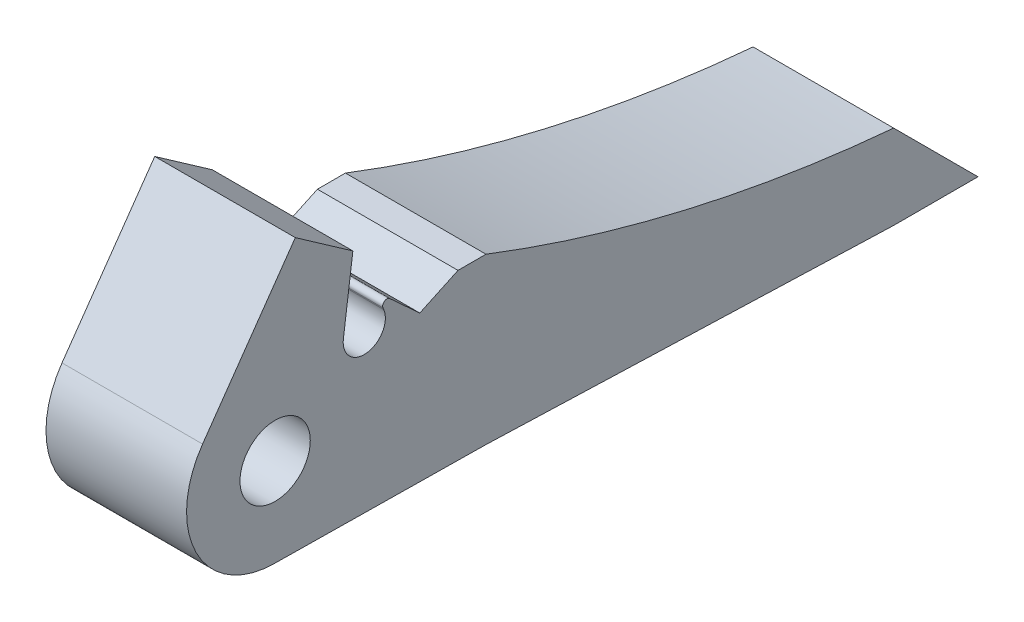
ISO-10303-21;
HEADER;
FILE_DESCRIPTION(('STEP AP214'),'2;1');
FILE_NAME('part.step','',(''),(''),'','','');
FILE_SCHEMA(('AUTOMOTIVE_DESIGN { 1 0 10303 214 1 1 1 1 }'));
ENDSEC;
DATA;
#1=APPLICATION_CONTEXT('core data for automotive mechanical design processes');
#2=APPLICATION_PROTOCOL_DEFINITION('international standard','automotive_design',2000,#1);
#3=PRODUCT_CONTEXT('',#1,'mechanical');
#4=PRODUCT('Part','Part','',(#3));
#5=PRODUCT_RELATED_PRODUCT_CATEGORY('part','',(#4));
#6=PRODUCT_DEFINITION_FORMATION('','',#4);
#7=PRODUCT_DEFINITION_CONTEXT('part definition',#1,'design');
#8=PRODUCT_DEFINITION('design','',#6,#7);
#9=PRODUCT_DEFINITION_SHAPE('','',#8);
#10=(LENGTH_UNIT() NAMED_UNIT(*) SI_UNIT(.MILLI.,.METRE.));
#11=(NAMED_UNIT(*) PLANE_ANGLE_UNIT() SI_UNIT($,.RADIAN.));
#12=(NAMED_UNIT(*) SI_UNIT($,.STERADIAN.) SOLID_ANGLE_UNIT());
#13=UNCERTAINTY_MEASURE_WITH_UNIT(LENGTH_MEASURE(1.E-05),#10,'distance_accuracy_value','');
#14=(GEOMETRIC_REPRESENTATION_CONTEXT(3) GLOBAL_UNCERTAINTY_ASSIGNED_CONTEXT((#13)) GLOBAL_UNIT_ASSIGNED_CONTEXT((#10,
#11,#12)) REPRESENTATION_CONTEXT('',''));
#15=CARTESIAN_POINT('',(0.,0.,0.));
#16=DIRECTION('',(0.,0.,1.));
#17=DIRECTION('',(1.,0.,0.));
#18=AXIS2_PLACEMENT_3D('',#15,#16,#17);
#19=CARTESIAN_POINT('',(6.35,9.525,-176.47164647412));
#20=DIRECTION('',(1.,0.,0.));
#21=DIRECTION('',(0.,0.,-1.));
#22=AXIS2_PLACEMENT_3D('',#19,#20,#21);
#23=PLANE('',#22);
#24=DIRECTION('',(0.,0.675997213115525,0.736904178207753));
#25=VECTOR('',#24,1.);
#26=CARTESIAN_POINT('',(6.35,14.5548502284291,-189.540378321137));
#27=LINE('',#26,#25);
#28=CARTESIAN_POINT('',(6.35,14.5548502284291,-189.540378321137));
#29=VERTEX_POINT('',#28);
#30=CARTESIAN_POINT('',(6.35,17.0473052344059,-186.823354534258));
#31=VERTEX_POINT('',#30);
#32=EDGE_CURVE('E200',#29,#31,#27,.T.);
#33=ORIENTED_EDGE('',*,*,#32,.T.);
#34=CARTESIAN_POINT('',(6.35,16.7665447425088,-186.565799596061));
#35=DIRECTION('',(1.,0.,0.));
#36=DIRECTION('',(0.,0.,-1.));
#37=AXIS2_PLACEMENT_3D('',#34,#35,#36);
#38=CIRCLE('',#37,0.381);
#39=CARTESIAN_POINT('',(6.35,16.6212011416768,-186.213611808514));
#40=VERTEX_POINT('',#39);
#41=EDGE_CURVE('E11',#31,#40,#38,.T.);
#42=ORIENTED_EDGE('',*,*,#41,.T.);
#43=DIRECTION('',(0.,-0.924377395136282,-0.381479267275513));
#44=VECTOR('',#43,1.);
#45=CARTESIAN_POINT('',(6.35,18.206999928397,-185.559172006775));
#46=LINE('',#45,#44);
#47=CARTESIAN_POINT('',(6.35,16.4460609906623,-186.285890010935));
#48=VERTEX_POINT('',#47);
#49=EDGE_CURVE('E202',#40,#48,#46,.T.);
#50=ORIENTED_EDGE('',*,*,#49,.T.);
#51=CARTESIAN_POINT('',(6.35,15.7193429865025,-184.524951073201));
#52=DIRECTION('',(-1.,0.,0.));
#53=DIRECTION('',(0.,0.,1.));
#54=AXIS2_PLACEMENT_3D('',#51,#52,#53);
#55=CIRCLE('',#54,1.905);
#56=CARTESIAN_POINT('',(6.35,15.9704562023799,-182.636574216529));
#57=VERTEX_POINT('',#56);
#58=EDGE_CURVE('E204',#48,#57,#55,.T.);
#59=ORIENTED_EDGE('',*,*,#58,.T.);
#60=DIRECTION('',(0.,0.991273940509862,-0.131817961090479));
#61=VECTOR('',#60,1.);
#62=CARTESIAN_POINT('',(6.35,15.9704562023799,-182.636574216529));
#63=LINE('',#62,#61);
#64=CARTESIAN_POINT('',(6.35,22.4356903032563,-183.496310301906));
#65=VERTEX_POINT('',#64);
#66=EDGE_CURVE('E206',#57,#65,#63,.T.);
#67=ORIENTED_EDGE('',*,*,#66,.T.);
#68=DIRECTION('',(0.,0.573576436351047,0.819152044288991));
#69=VECTOR('',#68,1.);
#70=CARTESIAN_POINT('',(6.35,26.0779006740854,-178.294694820671));
#71=LINE('',#70,#69);
#72=CARTESIAN_POINT('',(6.35,26.0779006740854,-178.294694820671));
#73=VERTEX_POINT('',#72);
#74=EDGE_CURVE('E208',#65,#73,#71,.T.);
#75=ORIENTED_EDGE('',*,*,#74,.T.);
#76=DIRECTION('',(0.,-0.819152044288991,0.573576436351048));
#77=VECTOR('',#76,1.);
#78=CARTESIAN_POINT('',(6.35,14.1141850672447,-169.917610967764));
#79=LINE('',#78,#77);
#80=CARTESIAN_POINT('',(6.35,14.1141850672447,-169.917610967764));
#81=VERTEX_POINT('',#80);
#82=EDGE_CURVE('E210',#73,#81,#79,.T.);
#83=ORIENTED_EDGE('',*,*,#82,.T.);
#84=CARTESIAN_POINT('',(6.35,9.525,-176.47164647412));
#85=DIRECTION('',(1.,0.,0.));
#86=DIRECTION('',(0.,0.,-1.));
#87=AXIS2_PLACEMENT_3D('',#84,#85,#86);
#88=CIRCLE('',#87,8.00100000000001);
#89=CARTESIAN_POINT('',(6.35,1.52470715135464,-176.365272906379));
#90=VERTEX_POINT('',#89);
#91=EDGE_CURVE('E192',#81,#90,#88,.T.);
#92=ORIENTED_EDGE('',*,*,#91,.T.);
#93=DIRECTION('',(0.,-0.0132950340883751,-0.999911617128528));
#94=VECTOR('',#93,1.);
#95=CARTESIAN_POINT('',(6.35,1.27000000001228,-195.521646474134));
#96=LINE('',#95,#94);
#97=CARTESIAN_POINT('',(6.35,1.27000000001228,-195.521646474134));
#98=VERTEX_POINT('',#97);
#99=EDGE_CURVE('E172',#90,#98,#96,.T.);
#100=ORIENTED_EDGE('',*,*,#99,.T.);
#101=DIRECTION('',(0.,-0.0344622758397916,-0.999405999353587));
#102=VECTOR('',#101,1.);
#103=CARTESIAN_POINT('',(6.35,1.27000000001228,-195.521646474134));
#104=LINE('',#103,#102);
#105=CARTESIAN_POINT('',(6.35,1.22757706777499E-11,-232.35164647412));
#106=VERTEX_POINT('',#105);
#107=EDGE_CURVE('E154',#98,#106,#104,.T.);
#108=ORIENTED_EDGE('',*,*,#107,.T.);
#109=DIRECTION('',(0.,0.,-1.));
#110=VECTOR('',#109,1.);
#111=CARTESIAN_POINT('',(6.35,1.22757706777499E-11,-232.35164647412));
#112=LINE('',#111,#110);
#113=CARTESIAN_POINT('',(6.35,1.22755538373154E-11,-239.97164647412));
#114=VERTEX_POINT('',#113);
#115=EDGE_CURVE('E163',#106,#114,#112,.T.);
#116=ORIENTED_EDGE('',*,*,#115,.T.);
#117=DIRECTION('',(0.,0.707106781186548,0.707106781186547));
#118=VECTOR('',#117,1.);
#119=CARTESIAN_POINT('',(6.35,7.62000000001227,-232.35164647412));
#120=LINE('',#119,#118);
#121=CARTESIAN_POINT('',(6.35,7.62000000001227,-232.35164647412));
#122=VERTEX_POINT('',#121);
#123=EDGE_CURVE('E160',#114,#122,#120,.T.);
#124=ORIENTED_EDGE('',*,*,#123,.T.);
#125=CARTESIAN_POINT('',(6.35,141.897207856514,-244.099379931479));
#126=DIRECTION('',(-1.,0.,0.));
#127=DIRECTION('',(0.,0.,-1.));
#128=AXIS2_PLACEMENT_3D('',#125,#126,#127);
#129=CIRCLE('',#128,134.790124976288);
#130=CARTESIAN_POINT('',(6.35,16.1650258056597,-195.52164647412));
#131=VERTEX_POINT('',#130);
#132=EDGE_CURVE('E174',#122,#131,#129,.T.);
#133=ORIENTED_EDGE('',*,*,#132,.T.);
#134=DIRECTION('',(0.,4.5834151490827E-13,1.));
#135=VECTOR('',#134,1.);
#136=CARTESIAN_POINT('',(6.35,16.1650258056608,-192.993410989747));
#137=LINE('',#136,#135);
#138=CARTESIAN_POINT('',(6.35,16.1650258056608,-192.993410989747));
#139=VERTEX_POINT('',#138);
#140=EDGE_CURVE('E196',#131,#139,#137,.T.);
#141=ORIENTED_EDGE('',*,*,#140,.T.);
#142=DIRECTION('',(0.,-0.422618261740703,0.906307787036648));
#143=VECTOR('',#142,1.);
#144=CARTESIAN_POINT('',(6.35,14.8232128246341,-190.115883765906));
#145=LINE('',#144,#143);
#146=EDGE_CURVE('E198',#139,#29,#145,.T.);
#147=ORIENTED_EDGE('',*,*,#146,.T.);
#148=EDGE_LOOP('',(#33,#42,#50,#59,#67,#75,#83,#92,#100,#108,#116,#124,#133,#141,#147));
#149=FACE_BOUND('',#148,.T.);
#150=CARTESIAN_POINT('',(6.35,9.525,-176.47164647412));
#151=DIRECTION('',(1.,0.,0.));
#152=DIRECTION('',(0.,0.,-1.));
#153=AXIS2_PLACEMENT_3D('',#150,#151,#152);
#154=CIRCLE('',#153,3.17499999999995);
#155=CARTESIAN_POINT('',(6.35,9.525,-179.64664647412));
#156=VERTEX_POINT('',#155);
#157=EDGE_CURVE('E184',#156,#156,#154,.T.);
#158=ORIENTED_EDGE('',*,*,#157,.F.);
#159=EDGE_LOOP('',(#158));
#160=FACE_BOUND('',#159,.T.);
#161=ADVANCED_FACE('F41',(#149,#160),#23,.T.);
#162=CARTESIAN_POINT('',(-6.35,9.525,-176.47164647412));
#163=DIRECTION('',(1.,0.,0.));
#164=DIRECTION('',(0.,0.,-1.));
#165=AXIS2_PLACEMENT_3D('',#162,#163,#164);
#166=PLANE('',#165);
#167=DIRECTION('',(0.,-0.924377395136282,-0.381479267275513));
#168=VECTOR('',#167,1.);
#169=CARTESIAN_POINT('',(-6.35,18.206999928397,-185.559172006775));
#170=LINE('',#169,#168);
#171=CARTESIAN_POINT('',(-6.35,16.6212011416768,-186.213611808514));
#172=VERTEX_POINT('',#171);
#173=CARTESIAN_POINT('',(-6.35,16.4460609906623,-186.285890010935));
#174=VERTEX_POINT('',#173);
#175=EDGE_CURVE('E224',#172,#174,#170,.T.);
#176=ORIENTED_EDGE('',*,*,#175,.F.);
#177=CARTESIAN_POINT('',(-6.35,16.7665447425088,-186.565799596061));
#178=DIRECTION('',(1.,0.,0.));
#179=DIRECTION('',(0.,0.,-1.));
#180=AXIS2_PLACEMENT_3D('',#177,#178,#179);
#181=CIRCLE('',#180,0.381);
#182=CARTESIAN_POINT('',(-6.35,17.0473052344059,-186.823354534258));
#183=VERTEX_POINT('',#182);
#184=EDGE_CURVE('E63',#172,#183,#181,.F.);
#185=ORIENTED_EDGE('',*,*,#184,.T.);
#186=DIRECTION('',(0.,0.675997213115525,0.736904178207753));
#187=VECTOR('',#186,1.);
#188=CARTESIAN_POINT('',(-6.35,14.5548502284291,-189.540378321137));
#189=LINE('',#188,#187);
#190=CARTESIAN_POINT('',(-6.35,14.5548502284291,-189.540378321137));
#191=VERTEX_POINT('',#190);
#192=EDGE_CURVE('E222',#191,#183,#189,.T.);
#193=ORIENTED_EDGE('',*,*,#192,.F.);
#194=DIRECTION('',(0.,-0.422618261740214,0.906307787036876));
#195=VECTOR('',#194,1.);
#196=CARTESIAN_POINT('',(-6.35,14.5548502284291,-189.540378321137));
#197=LINE('',#196,#195);
#198=CARTESIAN_POINT('',(-6.35,16.1650258056608,-192.993410989747));
#199=VERTEX_POINT('',#198);
#200=EDGE_CURVE('E220',#199,#191,#197,.T.);
#201=ORIENTED_EDGE('',*,*,#200,.F.);
#202=DIRECTION('',(0.,4.5834151490827E-13,1.));
#203=VECTOR('',#202,1.);
#204=CARTESIAN_POINT('',(-6.35,16.1650258056608,-192.993410989747));
#205=LINE('',#204,#203);
#206=CARTESIAN_POINT('',(-6.35,16.1650258056597,-195.52164647412));
#207=VERTEX_POINT('',#206);
#208=EDGE_CURVE('E217',#207,#199,#205,.T.);
#209=ORIENTED_EDGE('',*,*,#208,.F.);
#210=CARTESIAN_POINT('',(-6.35,141.897207856514,-244.099379931479));
#211=DIRECTION('',(1.,0.,0.));
#212=DIRECTION('',(0.,0.,-1.));
#213=AXIS2_PLACEMENT_3D('',#210,#211,#212);
#214=CIRCLE('',#213,134.790124976288);
#215=CARTESIAN_POINT('',(-6.35,7.62000000001227,-232.35164647412));
#216=VERTEX_POINT('',#215);
#217=EDGE_CURVE('E191',#207,#216,#214,.T.);
#218=ORIENTED_EDGE('',*,*,#217,.T.);
#219=DIRECTION('',(0.,-0.707106781186548,-0.707106781186547));
#220=VECTOR('',#219,1.);
#221=CARTESIAN_POINT('',(-6.35,7.62000000001227,-232.35164647412));
#222=LINE('',#221,#220);
#223=CARTESIAN_POINT('',(-6.35,1.22755538373154E-11,-239.97164647412));
#224=VERTEX_POINT('',#223);
#225=EDGE_CURVE('E345',#216,#224,#222,.T.);
#226=ORIENTED_EDGE('',*,*,#225,.T.);
#227=DIRECTION('',(0.,0.,1.));
#228=VECTOR('',#227,1.);
#229=CARTESIAN_POINT('',(-6.35,1.22757706777499E-11,-232.35164647412));
#230=LINE('',#229,#228);
#231=CARTESIAN_POINT('',(-6.35,1.22759875181844E-11,-232.35164647412));
#232=VERTEX_POINT('',#231);
#233=EDGE_CURVE('E343',#224,#232,#230,.T.);
#234=ORIENTED_EDGE('',*,*,#233,.T.);
#235=DIRECTION('',(0.,0.0344622758397916,0.999405999353587));
#236=VECTOR('',#235,1.);
#237=CARTESIAN_POINT('',(-6.35,1.27000000001228,-195.521646474134));
#238=LINE('',#237,#236);
#239=CARTESIAN_POINT('',(-6.35,1.27000000001228,-195.521646474134));
#240=VERTEX_POINT('',#239);
#241=EDGE_CURVE('E156',#232,#240,#238,.T.);
#242=ORIENTED_EDGE('',*,*,#241,.T.);
#243=DIRECTION('',(0.,-0.0132950340883751,-0.999911617128528));
#244=VECTOR('',#243,1.);
#245=CARTESIAN_POINT('',(-6.35,1.27000000001228,-195.521646474134));
#246=LINE('',#245,#244);
#247=CARTESIAN_POINT('',(-6.35,1.52470715135464,-176.365272906379));
#248=VERTEX_POINT('',#247);
#249=EDGE_CURVE('E215',#248,#240,#246,.T.);
#250=ORIENTED_EDGE('',*,*,#249,.F.);
#251=CARTESIAN_POINT('',(-6.35,9.525,-176.47164647412));
#252=DIRECTION('',(1.,0.,0.));
#253=DIRECTION('',(0.,0.,-1.));
#254=AXIS2_PLACEMENT_3D('',#251,#252,#253);
#255=CIRCLE('',#254,8.00100000000001);
#256=CARTESIAN_POINT('',(-6.35,14.1141850672447,-169.917610967764));
#257=VERTEX_POINT('',#256);
#258=EDGE_CURVE('E187',#257,#248,#255,.T.);
#259=ORIENTED_EDGE('',*,*,#258,.F.);
#260=DIRECTION('',(0.,-0.819152044288991,0.573576436351048));
#261=VECTOR('',#260,1.);
#262=CARTESIAN_POINT('',(-6.35,14.1141850672447,-169.917610967764));
#263=LINE('',#262,#261);
#264=CARTESIAN_POINT('',(-6.35,26.0779006740854,-178.294694820671));
#265=VERTEX_POINT('',#264);
#266=EDGE_CURVE('E194',#265,#257,#263,.T.);
#267=ORIENTED_EDGE('',*,*,#266,.F.);
#268=DIRECTION('',(0.,0.573576436351047,0.819152044288991));
#269=VECTOR('',#268,1.);
#270=CARTESIAN_POINT('',(-6.35,26.0779006740854,-178.294694820671));
#271=LINE('',#270,#269);
#272=CARTESIAN_POINT('',(-6.35,22.4356903032563,-183.496310301906));
#273=VERTEX_POINT('',#272);
#274=EDGE_CURVE('E230',#273,#265,#271,.T.);
#275=ORIENTED_EDGE('',*,*,#274,.F.);
#276=DIRECTION('',(0.,0.991273940509862,-0.131817961090479));
#277=VECTOR('',#276,1.);
#278=CARTESIAN_POINT('',(-6.35,15.9704562023799,-182.636574216529));
#279=LINE('',#278,#277);
#280=CARTESIAN_POINT('',(-6.35,15.9704562023799,-182.636574216529));
#281=VERTEX_POINT('',#280);
#282=EDGE_CURVE('E228',#281,#273,#279,.T.);
#283=ORIENTED_EDGE('',*,*,#282,.F.);
#284=CARTESIAN_POINT('',(-6.35,15.7193429865025,-184.524951073201));
#285=DIRECTION('',(-1.,0.,0.));
#286=DIRECTION('',(0.,0.,1.));
#287=AXIS2_PLACEMENT_3D('',#284,#285,#286);
#288=CIRCLE('',#287,1.905);
#289=EDGE_CURVE('E226',#174,#281,#288,.T.);
#290=ORIENTED_EDGE('',*,*,#289,.F.);
#291=EDGE_LOOP('',(#176,#185,#193,#201,#209,#218,#226,#234,#242,#250,#259,#267,#275,#283,#290));
#292=FACE_BOUND('',#291,.T.);
#293=CARTESIAN_POINT('',(-6.35,9.525,-176.47164647412));
#294=DIRECTION('',(1.,0.,0.));
#295=DIRECTION('',(0.,0.,-1.));
#296=AXIS2_PLACEMENT_3D('',#293,#294,#295);
#297=CIRCLE('',#296,3.17499999999995);
#298=CARTESIAN_POINT('',(-6.35,9.525,-179.64664647412));
#299=VERTEX_POINT('',#298);
#300=EDGE_CURVE('E188',#299,#299,#297,.T.);
#301=ORIENTED_EDGE('',*,*,#300,.T.);
#302=EDGE_LOOP('',(#301));
#303=FACE_BOUND('',#302,.T.);
#304=ADVANCED_FACE('F271',(#292,#303),#166,.F.);
#305=CARTESIAN_POINT('',(6.35,9.525,-176.47164647412));
#306=DIRECTION('',(-1.,0.,0.));
#307=DIRECTION('',(0.,0.,1.));
#308=AXIS2_PLACEMENT_3D('',#305,#306,#307);
#309=CYLINDRICAL_SURFACE('',#308,8.00100000000001);
#310=ORIENTED_EDGE('',*,*,#258,.T.);
#311=DIRECTION('',(-1.,0.,0.));
#312=VECTOR('',#311,1.);
#313=CARTESIAN_POINT('',(6.35,1.52470715135464,-176.365272906379));
#314=LINE('',#313,#312);
#315=EDGE_CURVE('E257',#90,#248,#314,.T.);
#316=ORIENTED_EDGE('',*,*,#315,.F.);
#317=ORIENTED_EDGE('',*,*,#91,.F.);
#318=DIRECTION('',(-1.,0.,0.));
#319=VECTOR('',#318,1.);
#320=CARTESIAN_POINT('',(6.35,14.1141850672447,-169.917610967764));
#321=LINE('',#320,#319);
#322=EDGE_CURVE('E212',#81,#257,#321,.T.);
#323=ORIENTED_EDGE('',*,*,#322,.T.);
#324=EDGE_LOOP('',(#310,#316,#317,#323));
#325=FACE_BOUND('',#324,.T.);
#326=ADVANCED_FACE('F303',(#325),#309,.T.);
#327=CARTESIAN_POINT('',(6.35,1.27000000001228,-195.521646474134));
#328=DIRECTION('',(0.,0.999911617128528,-0.0132950340883751));
#329=DIRECTION('',(0.,0.0132950340883751,0.999911617128528));
#330=AXIS2_PLACEMENT_3D('',#327,#328,#329);
#331=PLANE('',#330);
#332=ORIENTED_EDGE('',*,*,#249,.T.);
#333=DIRECTION('',(-1.,0.,0.));
#334=VECTOR('',#333,1.);
#335=CARTESIAN_POINT('',(6.35,1.27000000001228,-195.521646474134));
#336=LINE('',#335,#334);
#337=EDGE_CURVE('E255',#98,#240,#336,.T.);
#338=ORIENTED_EDGE('',*,*,#337,.F.);
#339=ORIENTED_EDGE('',*,*,#99,.F.);
#340=ORIENTED_EDGE('',*,*,#315,.T.);
#341=EDGE_LOOP('',(#332,#338,#339,#340));
#342=FACE_BOUND('',#341,.T.);
#343=ADVANCED_FACE('F329',(#342),#331,.F.);
#344=CARTESIAN_POINT('',(6.35,16.1650258056608,-192.993410989747));
#345=DIRECTION('',(0.,-1.,4.5834151490827E-13));
#346=DIRECTION('',(0.,-4.5834151490827E-13,-1.));
#347=AXIS2_PLACEMENT_3D('',#344,#345,#346);
#348=PLANE('',#347);
#349=ORIENTED_EDGE('',*,*,#208,.T.);
#350=DIRECTION('',(-1.,0.,0.));
#351=VECTOR('',#350,1.);
#352=CARTESIAN_POINT('',(6.35,16.1650258056608,-192.993410989747));
#353=LINE('',#352,#351);
#354=EDGE_CURVE('E250',#139,#199,#353,.T.);
#355=ORIENTED_EDGE('',*,*,#354,.F.);
#356=ORIENTED_EDGE('',*,*,#140,.F.);
#357=DIRECTION('',(-1.,0.,0.));
#358=VECTOR('',#357,1.);
#359=CARTESIAN_POINT('',(6.35,16.1650258056597,-195.52164647412));
#360=LINE('',#359,#358);
#361=EDGE_CURVE('E253',#131,#207,#360,.T.);
#362=ORIENTED_EDGE('',*,*,#361,.T.);
#363=EDGE_LOOP('',(#349,#355,#356,#362));
#364=FACE_BOUND('',#363,.T.);
#365=ADVANCED_FACE('F325',(#364),#348,.F.);
#366=CARTESIAN_POINT('',(6.35,14.5548502284291,-189.540378321137));
#367=DIRECTION('',(0.,-0.906307787036876,-0.422618261740214));
#368=DIRECTION('',(0.,0.422618261740214,-0.906307787036876));
#369=AXIS2_PLACEMENT_3D('',#366,#367,#368);
#370=PLANE('',#369);
#371=ORIENTED_EDGE('',*,*,#200,.T.);
#372=DIRECTION('',(-1.,0.,0.));
#373=VECTOR('',#372,1.);
#374=CARTESIAN_POINT('',(6.35,14.5548502284291,-189.540378321137));
#375=LINE('',#374,#373);
#376=EDGE_CURVE('E247',#29,#191,#375,.T.);
#377=ORIENTED_EDGE('',*,*,#376,.F.);
#378=ORIENTED_EDGE('',*,*,#146,.F.);
#379=ORIENTED_EDGE('',*,*,#354,.T.);
#380=EDGE_LOOP('',(#371,#377,#378,#379));
#381=FACE_BOUND('',#380,.T.);
#382=ADVANCED_FACE('F322',(#381),#370,.F.);
#383=CARTESIAN_POINT('',(6.35,14.5548502284291,-189.540378321137));
#384=DIRECTION('',(0.,-0.736904178207753,0.675997213115525));
#385=DIRECTION('',(0.,-0.675997213115525,-0.736904178207753));
#386=AXIS2_PLACEMENT_3D('',#383,#384,#385);
#387=PLANE('',#386);
#388=ORIENTED_EDGE('',*,*,#192,.T.);
#389=DIRECTION('',(-1.,0.,0.));
#390=VECTOR('',#389,1.);
#391=CARTESIAN_POINT('',(6.35,17.0473052344059,-186.823354534258));
#392=LINE('',#391,#390);
#393=EDGE_CURVE('E49',#183,#31,#392,.F.);
#394=ORIENTED_EDGE('',*,*,#393,.T.);
#395=ORIENTED_EDGE('',*,*,#32,.F.);
#396=ORIENTED_EDGE('',*,*,#376,.T.);
#397=EDGE_LOOP('',(#388,#394,#395,#396));
#398=FACE_BOUND('',#397,.T.);
#399=ADVANCED_FACE('F319',(#398),#387,.F.);
#400=CARTESIAN_POINT('',(6.35,18.206999928397,-185.559172006775));
#401=DIRECTION('',(0.,0.381479267275513,-0.924377395136282));
#402=DIRECTION('',(0.,0.924377395136282,0.381479267275513));
#403=AXIS2_PLACEMENT_3D('',#400,#401,#402);
#404=PLANE('',#403);
#405=ORIENTED_EDGE('',*,*,#49,.F.);
#406=DIRECTION('',(-1.,0.,0.));
#407=VECTOR('',#406,1.);
#408=CARTESIAN_POINT('',(6.35,16.6212011416768,-186.213611808514));
#409=LINE('',#408,#407);
#410=EDGE_CURVE('E260',#40,#172,#409,.T.);
#411=ORIENTED_EDGE('',*,*,#410,.T.);
#412=ORIENTED_EDGE('',*,*,#175,.T.);
#413=DIRECTION('',(-1.,0.,0.));
#414=VECTOR('',#413,1.);
#415=CARTESIAN_POINT('',(6.35,16.4460609906623,-186.285890010935));
#416=LINE('',#415,#414);
#417=EDGE_CURVE('E244',#48,#174,#416,.T.);
#418=ORIENTED_EDGE('',*,*,#417,.F.);
#419=EDGE_LOOP('',(#405,#411,#412,#418));
#420=FACE_BOUND('',#419,.T.);
#421=ADVANCED_FACE('F266',(#420),#404,.F.);
#422=CARTESIAN_POINT('',(6.35,15.7193429865025,-184.524951073201));
#423=DIRECTION('',(-1.,0.,0.));
#424=DIRECTION('',(0.,0.,1.));
#425=AXIS2_PLACEMENT_3D('',#422,#423,#424);
#426=CYLINDRICAL_SURFACE('',#425,1.905);
#427=ORIENTED_EDGE('',*,*,#289,.T.);
#428=DIRECTION('',(-1.,0.,0.));
#429=VECTOR('',#428,1.);
#430=CARTESIAN_POINT('',(6.35,15.9704562023799,-182.636574216529));
#431=LINE('',#430,#429);
#432=EDGE_CURVE('E241',#57,#281,#431,.T.);
#433=ORIENTED_EDGE('',*,*,#432,.F.);
#434=ORIENTED_EDGE('',*,*,#58,.F.);
#435=ORIENTED_EDGE('',*,*,#417,.T.);
#436=EDGE_LOOP('',(#427,#433,#434,#435));
#437=FACE_BOUND('',#436,.T.);
#438=ADVANCED_FACE('F277',(#437),#426,.F.);
#439=CARTESIAN_POINT('',(6.35,15.9704562023799,-182.636574216529));
#440=DIRECTION('',(0.,0.131817961090479,0.991273940509862));
#441=DIRECTION('',(0.,-0.991273940509862,0.131817961090479));
#442=AXIS2_PLACEMENT_3D('',#439,#440,#441);
#443=PLANE('',#442);
#444=ORIENTED_EDGE('',*,*,#282,.T.);
#445=DIRECTION('',(-1.,0.,0.));
#446=VECTOR('',#445,1.);
#447=CARTESIAN_POINT('',(6.35,22.4356903032563,-183.496310301906));
#448=LINE('',#447,#446);
#449=EDGE_CURVE('E238',#65,#273,#448,.T.);
#450=ORIENTED_EDGE('',*,*,#449,.F.);
#451=ORIENTED_EDGE('',*,*,#66,.F.);
#452=ORIENTED_EDGE('',*,*,#432,.T.);
#453=EDGE_LOOP('',(#444,#450,#451,#452));
#454=FACE_BOUND('',#453,.T.);
#455=ADVANCED_FACE('F281',(#454),#443,.F.);
#456=CARTESIAN_POINT('',(6.35,26.0779006740854,-178.294694820671));
#457=DIRECTION('',(0.,-0.819152044288991,0.573576436351047));
#458=DIRECTION('',(0.,-0.573576436351047,-0.819152044288991));
#459=AXIS2_PLACEMENT_3D('',#456,#457,#458);
#460=PLANE('',#459);
#461=ORIENTED_EDGE('',*,*,#274,.T.);
#462=DIRECTION('',(-1.,0.,0.));
#463=VECTOR('',#462,1.);
#464=CARTESIAN_POINT('',(6.35,26.0779006740854,-178.294694820671));
#465=LINE('',#464,#463);
#466=EDGE_CURVE('E235',#73,#265,#465,.T.);
#467=ORIENTED_EDGE('',*,*,#466,.F.);
#468=ORIENTED_EDGE('',*,*,#74,.F.);
#469=ORIENTED_EDGE('',*,*,#449,.T.);
#470=EDGE_LOOP('',(#461,#467,#468,#469));
#471=FACE_BOUND('',#470,.T.);
#472=ADVANCED_FACE('F308',(#471),#460,.F.);
#473=CARTESIAN_POINT('',(6.35,14.1141850672447,-169.917610967764));
#474=DIRECTION('',(0.,-0.573576436351048,-0.819152044288991));
#475=DIRECTION('',(0.,0.819152044288991,-0.573576436351048));
#476=AXIS2_PLACEMENT_3D('',#473,#474,#475);
#477=PLANE('',#476);
#478=ORIENTED_EDGE('',*,*,#266,.T.);
#479=ORIENTED_EDGE('',*,*,#322,.F.);
#480=ORIENTED_EDGE('',*,*,#82,.F.);
#481=ORIENTED_EDGE('',*,*,#466,.T.);
#482=EDGE_LOOP('',(#478,#479,#480,#481));
#483=FACE_BOUND('',#482,.T.);
#484=ADVANCED_FACE('F295',(#483),#477,.F.);
#485=CARTESIAN_POINT('',(6.35,9.525,-176.47164647412));
#486=DIRECTION('',(-1.,0.,0.));
#487=DIRECTION('',(0.,0.,1.));
#488=AXIS2_PLACEMENT_3D('',#485,#486,#487);
#489=CYLINDRICAL_SURFACE('',#488,3.17499999999995);
#490=ORIENTED_EDGE('',*,*,#157,.T.);
#491=EDGE_LOOP('',(#490));
#492=FACE_BOUND('',#491,.T.);
#493=ORIENTED_EDGE('',*,*,#300,.F.);
#494=EDGE_LOOP('',(#493));
#495=FACE_BOUND('',#494,.T.);
#496=ADVANCED_FACE('F287',(#492,#495),#489,.F.);
#497=CARTESIAN_POINT('',(6.35,16.7665447425088,-186.565799596061));
#498=DIRECTION('',(-1.,0.,0.));
#499=DIRECTION('',(0.,0.,1.));
#500=AXIS2_PLACEMENT_3D('',#497,#498,#499);
#501=CYLINDRICAL_SURFACE('',#500,0.381);
#502=ORIENTED_EDGE('',*,*,#41,.F.);
#503=ORIENTED_EDGE('',*,*,#393,.F.);
#504=ORIENTED_EDGE('',*,*,#184,.F.);
#505=ORIENTED_EDGE('',*,*,#410,.F.);
#506=EDGE_LOOP('',(#502,#503,#504,#505));
#507=FACE_BOUND('',#506,.T.);
#508=ADVANCED_FACE('F43',(#507),#501,.T.);
#509=CARTESIAN_POINT('',(-53.6481031257835,141.897207856514,-244.099379931479));
#510=DIRECTION('',(1.,0.,0.));
#511=DIRECTION('',(0.,0.,-1.));
#512=AXIS2_PLACEMENT_3D('',#509,#510,#511);
#513=CYLINDRICAL_SURFACE('',#512,134.790124976288);
#514=ORIENTED_EDGE('',*,*,#217,.F.);
#515=ORIENTED_EDGE('',*,*,#361,.F.);
#516=ORIENTED_EDGE('',*,*,#132,.F.);
#517=DIRECTION('',(1.,0.,0.));
#518=VECTOR('',#517,1.);
#519=CARTESIAN_POINT('',(-53.6481031257835,7.62000000001227,-232.35164647412));
#520=LINE('',#519,#518);
#521=EDGE_CURVE('E181',#216,#122,#520,.T.);
#522=ORIENTED_EDGE('',*,*,#521,.F.);
#523=EDGE_LOOP('',(#514,#515,#516,#522));
#524=FACE_BOUND('',#523,.T.);
#525=ADVANCED_FACE('F286',(#524),#513,.F.);
#526=CARTESIAN_POINT('',(-53.6481031257835,7.62000000001227,-232.35164647412));
#527=DIRECTION('',(0.,0.707106781186547,-0.707106781186548));
#528=DIRECTION('',(0.,0.707106781186548,0.707106781186547));
#529=AXIS2_PLACEMENT_3D('',#526,#527,#528);
#530=PLANE('',#529);
#531=ORIENTED_EDGE('',*,*,#225,.F.);
#532=ORIENTED_EDGE('',*,*,#521,.T.);
#533=ORIENTED_EDGE('',*,*,#123,.F.);
#534=DIRECTION('',(1.,0.,0.));
#535=VECTOR('',#534,1.);
#536=CARTESIAN_POINT('',(-53.6481031257835,1.22755538373154E-11,-239.97164647412));
#537=LINE('',#536,#535);
#538=EDGE_CURVE('E159',#224,#114,#537,.T.);
#539=ORIENTED_EDGE('',*,*,#538,.F.);
#540=EDGE_LOOP('',(#531,#532,#533,#539));
#541=FACE_BOUND('',#540,.T.);
#542=ADVANCED_FACE('F292',(#541),#530,.T.);
#543=CARTESIAN_POINT('',(-53.6481031257835,1.22757706777499E-11,-232.35164647412));
#544=DIRECTION('',(0.,-1.,0.));
#545=DIRECTION('',(0.,0.,-1.));
#546=AXIS2_PLACEMENT_3D('',#543,#544,#545);
#547=PLANE('',#546);
#548=ORIENTED_EDGE('',*,*,#233,.F.);
#549=ORIENTED_EDGE('',*,*,#538,.T.);
#550=ORIENTED_EDGE('',*,*,#115,.F.);
#551=DIRECTION('',(1.,0.,0.));
#552=VECTOR('',#551,1.);
#553=CARTESIAN_POINT('',(-53.6481031257835,1.22757706777499E-11,-232.35164647412));
#554=LINE('',#553,#552);
#555=EDGE_CURVE('E149',#232,#106,#554,.T.);
#556=ORIENTED_EDGE('',*,*,#555,.F.);
#557=EDGE_LOOP('',(#548,#549,#550,#556));
#558=FACE_BOUND('',#557,.T.);
#559=ADVANCED_FACE('F164',(#558),#547,.T.);
#560=CARTESIAN_POINT('',(-53.6481031257835,1.27000000001228,-195.521646474134));
#561=DIRECTION('',(0.,-0.999405999353587,0.0344622758397916));
#562=DIRECTION('',(0.,-0.0344622758397916,-0.999405999353587));
#563=AXIS2_PLACEMENT_3D('',#560,#561,#562);
#564=PLANE('',#563);
#565=ORIENTED_EDGE('',*,*,#241,.F.);
#566=ORIENTED_EDGE('',*,*,#555,.T.);
#567=ORIENTED_EDGE('',*,*,#107,.F.);
#568=ORIENTED_EDGE('',*,*,#337,.T.);
#569=EDGE_LOOP('',(#565,#566,#567,#568));
#570=FACE_BOUND('',#569,.T.);
#571=ADVANCED_FACE('F151',(#570),#564,.T.);
#572=CLOSED_SHELL('',(#161,#304,#326,#343,#365,#382,#399,#421,#438,#455,#472,#484,#496,#508,
#525,#542,#559,#571));
#573=MANIFOLD_SOLID_BREP('B2',#572);
#574=ADVANCED_BREP_SHAPE_REPRESENTATION('',(#18,#573),#14);
#575=SHAPE_DEFINITION_REPRESENTATION(#9,#574);
ENDSEC;
END-ISO-10303-21;
